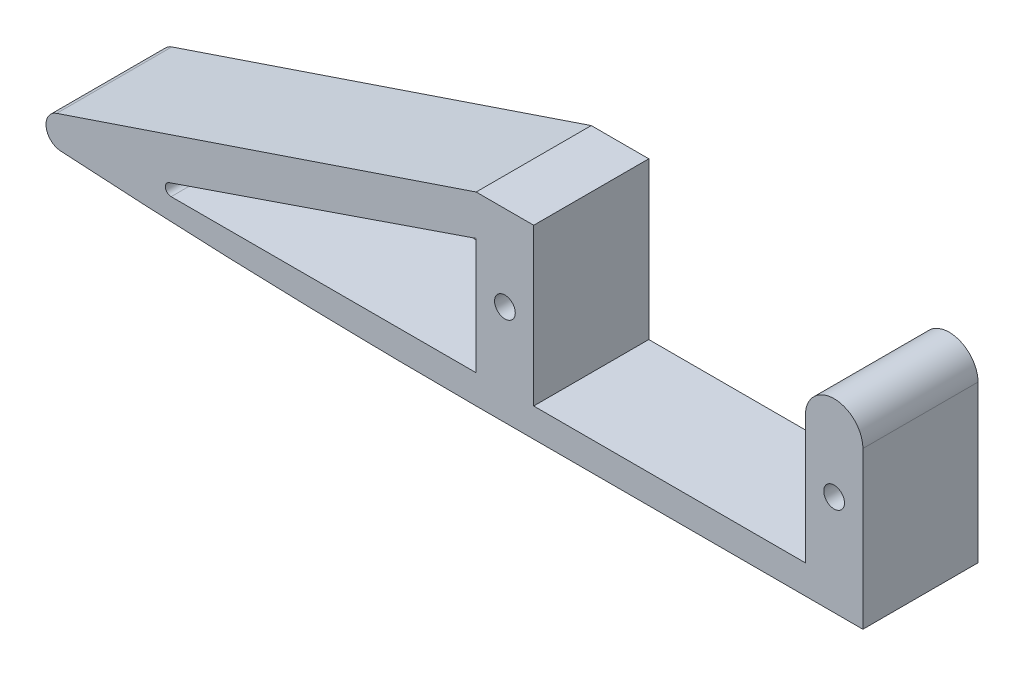
ISO-10303-21;
HEADER;
FILE_DESCRIPTION(('STEP AP214'),'2;1');
FILE_NAME('part.step','',(''),(''),'','','');
FILE_SCHEMA(('AUTOMOTIVE_DESIGN { 1 0 10303 214 1 1 1 1 }'));
ENDSEC;
DATA;
#1=APPLICATION_CONTEXT('core data for automotive mechanical design processes');
#2=APPLICATION_PROTOCOL_DEFINITION('international standard','automotive_design',2000,#1);
#3=PRODUCT_CONTEXT('',#1,'mechanical');
#4=PRODUCT('Part','Part','',(#3));
#5=PRODUCT_RELATED_PRODUCT_CATEGORY('part','',(#4));
#6=PRODUCT_DEFINITION_FORMATION('','',#4);
#7=PRODUCT_DEFINITION_CONTEXT('part definition',#1,'design');
#8=PRODUCT_DEFINITION('design','',#6,#7);
#9=PRODUCT_DEFINITION_SHAPE('','',#8);
#10=(LENGTH_UNIT() NAMED_UNIT(*) SI_UNIT(.MILLI.,.METRE.));
#11=(NAMED_UNIT(*) PLANE_ANGLE_UNIT() SI_UNIT($,.RADIAN.));
#12=(NAMED_UNIT(*) SI_UNIT($,.STERADIAN.) SOLID_ANGLE_UNIT());
#13=UNCERTAINTY_MEASURE_WITH_UNIT(LENGTH_MEASURE(1.E-05),#10,'distance_accuracy_value','');
#14=(GEOMETRIC_REPRESENTATION_CONTEXT(3) GLOBAL_UNCERTAINTY_ASSIGNED_CONTEXT((#13)) GLOBAL_UNIT_ASSIGNED_CONTEXT((#10,
#11,#12)) REPRESENTATION_CONTEXT('',''));
#15=CARTESIAN_POINT('',(0.,0.,0.));
#16=DIRECTION('',(0.,0.,1.));
#17=DIRECTION('',(1.,0.,0.));
#18=AXIS2_PLACEMENT_3D('',#15,#16,#17);
#19=CARTESIAN_POINT('',(-43.2987970035685,3.,5.));
#20=DIRECTION('',(0.,0.,1.));
#21=DIRECTION('',(1.,0.,0.));
#22=AXIS2_PLACEMENT_3D('',#19,#20,#21);
#23=CYLINDRICAL_SURFACE('',#22,0.5);
#24=CARTESIAN_POINT('',(-43.2987970035685,3.,5.));
#25=DIRECTION('',(0.,0.,-1.));
#26=DIRECTION('',(1.,0.,0.));
#27=AXIS2_PLACEMENT_3D('',#24,#25,#26);
#28=CIRCLE('',#27,0.5);
#29=CARTESIAN_POINT('',(-43.2987970035685,2.5,5.));
#30=VERTEX_POINT('',#29);
#31=CARTESIAN_POINT('',(-43.4608976764807,3.47299405053493,5.));
#32=VERTEX_POINT('',#31);
#33=EDGE_CURVE('E27',#30,#32,#28,.T.);
#34=ORIENTED_EDGE('',*,*,#33,.F.);
#35=DIRECTION('',(0.,0.,1.));
#36=VECTOR('',#35,1.);
#37=CARTESIAN_POINT('',(-43.2987970035685,2.5,5.));
#38=LINE('',#37,#36);
#39=CARTESIAN_POINT('',(-43.2987970035685,2.5,-5.));
#40=VERTEX_POINT('',#39);
#41=EDGE_CURVE('E150',#40,#30,#38,.T.);
#42=ORIENTED_EDGE('',*,*,#41,.F.);
#43=CARTESIAN_POINT('',(-43.2987970035685,3.,-5.));
#44=DIRECTION('',(0.,0.,1.));
#45=DIRECTION('',(1.,0.,0.));
#46=AXIS2_PLACEMENT_3D('',#43,#44,#45);
#47=CIRCLE('',#46,0.5);
#48=CARTESIAN_POINT('',(-43.4608976764807,3.47299405053493,-5.));
#49=VERTEX_POINT('',#48);
#50=EDGE_CURVE('E11',#49,#40,#47,.T.);
#51=ORIENTED_EDGE('',*,*,#50,.F.);
#52=DIRECTION('',(0.,0.,-1.));
#53=VECTOR('',#52,1.);
#54=CARTESIAN_POINT('',(-43.4608976764806,3.47299405053493,-5.));
#55=LINE('',#54,#53);
#56=EDGE_CURVE('E147',#32,#49,#55,.T.);
#57=ORIENTED_EDGE('',*,*,#56,.F.);
#58=EDGE_LOOP('',(#34,#42,#51,#57));
#59=FACE_BOUND('',#58,.T.);
#60=ADVANCED_FACE('F16',(#59),#23,.F.);
#61=CARTESIAN_POINT('',(-18.685,8.04999999999867,-5.));
#62=DIRECTION('',(0.,0.,1.));
#63=DIRECTION('',(1.,0.,0.));
#64=AXIS2_PLACEMENT_3D('',#61,#62,#63);
#65=PLANE('',#64);
#66=CARTESIAN_POINT('',(14.3,8.7,-5.));
#67=DIRECTION('',(0.,0.,1.));
#68=DIRECTION('',(1.,0.,0.));
#69=AXIS2_PLACEMENT_3D('',#66,#67,#68);
#70=CIRCLE('',#69,0.9);
#71=CARTESIAN_POINT('',(15.2,8.7,-5.));
#72=VERTEX_POINT('',#71);
#73=EDGE_CURVE('E39',#72,#72,#70,.T.);
#74=ORIENTED_EDGE('',*,*,#73,.T.);
#75=EDGE_LOOP('',(#74));
#76=FACE_BOUND('',#75,.T.);
#77=CARTESIAN_POINT('',(-14.3,8.7,-5.));
#78=DIRECTION('',(0.,0.,1.));
#79=DIRECTION('',(1.,0.,0.));
#80=AXIS2_PLACEMENT_3D('',#77,#78,#79);
#81=CIRCLE('',#80,0.9);
#82=CARTESIAN_POINT('',(-13.4,8.7,-5.));
#83=VERTEX_POINT('',#82);
#84=EDGE_CURVE('E81',#83,#83,#81,.T.);
#85=ORIENTED_EDGE('',*,*,#84,.T.);
#86=EDGE_LOOP('',(#85));
#87=FACE_BOUND('',#86,.T.);
#88=DIRECTION('',(0.,1.,0.));
#89=VECTOR('',#88,1.);
#90=CARTESIAN_POINT('',(-16.8,7.555,-5.));
#91=LINE('',#90,#89);
#92=CARTESIAN_POINT('',(-16.8,2.5,-5.));
#93=VERTEX_POINT('',#92);
#94=CARTESIAN_POINT('',(-16.8,12.61,-5.));
#95=VERTEX_POINT('',#94);
#96=EDGE_CURVE('E158',#93,#95,#91,.T.);
#97=ORIENTED_EDGE('',*,*,#96,.T.);
#98=DIRECTION('',(-0.945988101069844,-0.324201345824275,0.));
#99=VECTOR('',#98,1.);
#100=CARTESIAN_POINT('',(-31.55,7.555,-5.));
#101=LINE('',#100,#99);
#102=EDGE_CURVE('E154',#95,#49,#101,.T.);
#103=ORIENTED_EDGE('',*,*,#102,.T.);
#104=ORIENTED_EDGE('',*,*,#50,.T.);
#105=DIRECTION('',(1.,0.,0.));
#106=VECTOR('',#105,1.);
#107=CARTESIAN_POINT('',(-31.55,2.5,-5.));
#108=LINE('',#107,#106);
#109=EDGE_CURVE('E277',#40,#93,#108,.T.);
#110=ORIENTED_EDGE('',*,*,#109,.T.);
#111=EDGE_LOOP('',(#97,#103,#104,#110));
#112=FACE_BOUND('',#111,.T.);
#113=CARTESIAN_POINT('',(-52.8,2.5,-5.));
#114=DIRECTION('',(0.,0.,1.));
#115=DIRECTION('',(1.,0.,0.));
#116=AXIS2_PLACEMENT_3D('',#113,#114,#115);
#117=CIRCLE('',#116,1.37);
#118=CARTESIAN_POINT('',(-53.2382271517839,3.79802040178087,-5.));
#119=VERTEX_POINT('',#118);
#120=CARTESIAN_POINT('',(-52.7999999999604,1.13,-5.));
#121=VERTEX_POINT('',#120);
#122=EDGE_CURVE('E190',#119,#121,#117,.T.);
#123=ORIENTED_EDGE('',*,*,#122,.F.);
#124=DIRECTION('',(-0.94746014728531,-0.319873833418895,0.));
#125=VECTOR('',#124,1.);
#126=CARTESIAN_POINT('',(-35.0191135758919,9.94901020089044,-5.));
#127=LINE('',#126,#125);
#128=CARTESIAN_POINT('',(-16.8,16.1,-5.));
#129=VERTEX_POINT('',#128);
#130=EDGE_CURVE('E163',#129,#119,#127,.T.);
#131=ORIENTED_EDGE('',*,*,#130,.F.);
#132=DIRECTION('',(-1.,0.,0.));
#133=VECTOR('',#132,1.);
#134=CARTESIAN_POINT('',(-14.3,16.1,-5.));
#135=LINE('',#134,#133);
#136=CARTESIAN_POINT('',(-11.8,16.1,-5.));
#137=VERTEX_POINT('',#136);
#138=EDGE_CURVE('E256',#137,#129,#135,.T.);
#139=ORIENTED_EDGE('',*,*,#138,.F.);
#140=DIRECTION('',(0.,1.,0.));
#141=VECTOR('',#140,1.);
#142=CARTESIAN_POINT('',(-11.8,9.3,-5.));
#143=LINE('',#142,#141);
#144=CARTESIAN_POINT('',(-11.8,2.5,-5.));
#145=VERTEX_POINT('',#144);
#146=EDGE_CURVE('E225',#145,#137,#143,.T.);
#147=ORIENTED_EDGE('',*,*,#146,.F.);
#148=DIRECTION('',(-1.,0.,0.));
#149=VECTOR('',#148,1.);
#150=CARTESIAN_POINT('',(0.,2.5,-5.));
#151=LINE('',#150,#149);
#152=CARTESIAN_POINT('',(11.8,2.5,-5.));
#153=VERTEX_POINT('',#152);
#154=EDGE_CURVE('E209',#153,#145,#151,.T.);
#155=ORIENTED_EDGE('',*,*,#154,.F.);
#156=DIRECTION('',(0.,-1.,0.));
#157=VECTOR('',#156,1.);
#158=CARTESIAN_POINT('',(11.8,8.05,-5.));
#159=LINE('',#158,#157);
#160=CARTESIAN_POINT('',(11.8,13.6,-5.));
#161=VERTEX_POINT('',#160);
#162=EDGE_CURVE('E269',#161,#153,#159,.T.);
#163=ORIENTED_EDGE('',*,*,#162,.F.);
#164=CARTESIAN_POINT('',(14.3,13.6,-5.));
#165=DIRECTION('',(0.,0.,1.));
#166=DIRECTION('',(1.,0.,0.));
#167=AXIS2_PLACEMENT_3D('',#164,#165,#166);
#168=CIRCLE('',#167,2.5);
#169=CARTESIAN_POINT('',(16.8,13.6,-5.));
#170=VERTEX_POINT('',#169);
#171=EDGE_CURVE('E200',#170,#161,#168,.T.);
#172=ORIENTED_EDGE('',*,*,#171,.F.);
#173=DIRECTION('',(0.,1.,0.));
#174=VECTOR('',#173,1.);
#175=CARTESIAN_POINT('',(16.8,6.8,-5.));
#176=LINE('',#175,#174);
#177=CARTESIAN_POINT('',(16.8,0.,-5.));
#178=VERTEX_POINT('',#177);
#179=EDGE_CURVE('E217',#178,#170,#176,.T.);
#180=ORIENTED_EDGE('',*,*,#179,.F.);
#181=DIRECTION('',(-1.,0.,0.));
#182=VECTOR('',#181,1.);
#183=CARTESIAN_POINT('',(0.,0.,-5.));
#184=LINE('',#183,#182);
#185=CARTESIAN_POINT('',(-16.8,-2.66453525910038E-12,-5.));
#186=VERTEX_POINT('',#185);
#187=EDGE_CURVE('E243',#178,#186,#184,.T.);
#188=ORIENTED_EDGE('',*,*,#187,.T.);
#189=CARTESIAN_POINT('',(-16.8,574.016327433628,-5.));
#190=DIRECTION('',(0.,0.,1.));
#191=DIRECTION('',(1.,0.,0.));
#192=AXIS2_PLACEMENT_3D('',#189,#190,#191);
#193=CIRCLE('',#192,574.01632743363);
#194=EDGE_CURVE('E182',#121,#186,#193,.T.);
#195=ORIENTED_EDGE('',*,*,#194,.F.);
#196=EDGE_LOOP('',(#123,#131,#139,#147,#155,#163,#172,#180,#188,#195));
#197=FACE_BOUND('',#196,.T.);
#198=ADVANCED_FACE('F155',(#76,#87,#112,#197),#65,.F.);
#199=CARTESIAN_POINT('',(-18.685,8.04999999999867,5.));
#200=DIRECTION('',(0.,0.,1.));
#201=DIRECTION('',(1.,0.,0.));
#202=AXIS2_PLACEMENT_3D('',#199,#200,#201);
#203=PLANE('',#202);
#204=CARTESIAN_POINT('',(14.3,8.7,5.));
#205=DIRECTION('',(0.,0.,1.));
#206=DIRECTION('',(1.,0.,0.));
#207=AXIS2_PLACEMENT_3D('',#204,#205,#206);
#208=CIRCLE('',#207,0.9);
#209=CARTESIAN_POINT('',(15.2,8.7,5.));
#210=VERTEX_POINT('',#209);
#211=EDGE_CURVE('E221',#210,#210,#208,.T.);
#212=ORIENTED_EDGE('',*,*,#211,.F.);
#213=EDGE_LOOP('',(#212));
#214=FACE_BOUND('',#213,.T.);
#215=CARTESIAN_POINT('',(-14.3,8.7,5.));
#216=DIRECTION('',(0.,0.,1.));
#217=DIRECTION('',(1.,0.,0.));
#218=AXIS2_PLACEMENT_3D('',#215,#216,#217);
#219=CIRCLE('',#218,0.9);
#220=CARTESIAN_POINT('',(-13.4,8.7,5.));
#221=VERTEX_POINT('',#220);
#222=EDGE_CURVE('E93',#221,#221,#219,.T.);
#223=ORIENTED_EDGE('',*,*,#222,.F.);
#224=EDGE_LOOP('',(#223));
#225=FACE_BOUND('',#224,.T.);
#226=DIRECTION('',(0.,1.,0.));
#227=VECTOR('',#226,1.);
#228=CARTESIAN_POINT('',(-16.8,7.555,5.));
#229=LINE('',#228,#227);
#230=CARTESIAN_POINT('',(-16.8,2.5,5.));
#231=VERTEX_POINT('',#230);
#232=CARTESIAN_POINT('',(-16.8,12.61,5.));
#233=VERTEX_POINT('',#232);
#234=EDGE_CURVE('E184',#231,#233,#229,.T.);
#235=ORIENTED_EDGE('',*,*,#234,.F.);
#236=DIRECTION('',(1.,0.,0.));
#237=VECTOR('',#236,1.);
#238=CARTESIAN_POINT('',(-31.55,2.5,5.));
#239=LINE('',#238,#237);
#240=EDGE_CURVE('E195',#30,#231,#239,.T.);
#241=ORIENTED_EDGE('',*,*,#240,.F.);
#242=ORIENTED_EDGE('',*,*,#33,.T.);
#243=DIRECTION('',(-0.945988101069844,-0.324201345824275,0.));
#244=VECTOR('',#243,1.);
#245=CARTESIAN_POINT('',(-31.55,7.555,5.));
#246=LINE('',#245,#244);
#247=EDGE_CURVE('E166',#233,#32,#246,.T.);
#248=ORIENTED_EDGE('',*,*,#247,.F.);
#249=EDGE_LOOP('',(#235,#241,#242,#248));
#250=FACE_BOUND('',#249,.T.);
#251=CARTESIAN_POINT('',(-52.8,2.5,5.));
#252=DIRECTION('',(0.,0.,1.));
#253=DIRECTION('',(1.,0.,0.));
#254=AXIS2_PLACEMENT_3D('',#251,#252,#253);
#255=CIRCLE('',#254,1.37);
#256=CARTESIAN_POINT('',(-53.2382271517839,3.79802040178087,5.));
#257=VERTEX_POINT('',#256);
#258=CARTESIAN_POINT('',(-52.7999999999604,1.13,5.));
#259=VERTEX_POINT('',#258);
#260=EDGE_CURVE('E183',#257,#259,#255,.T.);
#261=ORIENTED_EDGE('',*,*,#260,.T.);
#262=CARTESIAN_POINT('',(-16.8,574.016327433628,5.));
#263=DIRECTION('',(0.,0.,1.));
#264=DIRECTION('',(1.,0.,0.));
#265=AXIS2_PLACEMENT_3D('',#262,#263,#264);
#266=CIRCLE('',#265,574.01632743363);
#267=CARTESIAN_POINT('',(-16.8,-2.66453525910038E-12,5.));
#268=VERTEX_POINT('',#267);
#269=EDGE_CURVE('E232',#259,#268,#266,.T.);
#270=ORIENTED_EDGE('',*,*,#269,.T.);
#271=DIRECTION('',(-1.,0.,0.));
#272=VECTOR('',#271,1.);
#273=CARTESIAN_POINT('',(0.,0.,5.));
#274=LINE('',#273,#272);
#275=CARTESIAN_POINT('',(16.8,0.,5.));
#276=VERTEX_POINT('',#275);
#277=EDGE_CURVE('E262',#276,#268,#274,.T.);
#278=ORIENTED_EDGE('',*,*,#277,.F.);
#279=DIRECTION('',(0.,1.,0.));
#280=VECTOR('',#279,1.);
#281=CARTESIAN_POINT('',(16.8,6.8,5.));
#282=LINE('',#281,#280);
#283=CARTESIAN_POINT('',(16.8,13.6,5.));
#284=VERTEX_POINT('',#283);
#285=EDGE_CURVE('E196',#276,#284,#282,.T.);
#286=ORIENTED_EDGE('',*,*,#285,.T.);
#287=CARTESIAN_POINT('',(14.3,13.6,5.));
#288=DIRECTION('',(0.,0.,1.));
#289=DIRECTION('',(1.,0.,0.));
#290=AXIS2_PLACEMENT_3D('',#287,#288,#289);
#291=CIRCLE('',#290,2.5);
#292=CARTESIAN_POINT('',(11.8,13.6,5.));
#293=VERTEX_POINT('',#292);
#294=EDGE_CURVE('E176',#284,#293,#291,.T.);
#295=ORIENTED_EDGE('',*,*,#294,.T.);
#296=DIRECTION('',(0.,-1.,0.));
#297=VECTOR('',#296,1.);
#298=CARTESIAN_POINT('',(11.8,8.05,5.));
#299=LINE('',#298,#297);
#300=CARTESIAN_POINT('',(11.8,2.5,5.));
#301=VERTEX_POINT('',#300);
#302=EDGE_CURVE('E357',#293,#301,#299,.T.);
#303=ORIENTED_EDGE('',*,*,#302,.T.);
#304=DIRECTION('',(-1.,0.,0.));
#305=VECTOR('',#304,1.);
#306=CARTESIAN_POINT('',(0.,2.5,5.));
#307=LINE('',#306,#305);
#308=CARTESIAN_POINT('',(-11.8,2.5,5.));
#309=VERTEX_POINT('',#308);
#310=EDGE_CURVE('E208',#301,#309,#307,.T.);
#311=ORIENTED_EDGE('',*,*,#310,.T.);
#312=DIRECTION('',(0.,1.,0.));
#313=VECTOR('',#312,1.);
#314=CARTESIAN_POINT('',(-11.8,9.3,5.));
#315=LINE('',#314,#313);
#316=CARTESIAN_POINT('',(-11.8,16.1,5.));
#317=VERTEX_POINT('',#316);
#318=EDGE_CURVE('E261',#309,#317,#315,.T.);
#319=ORIENTED_EDGE('',*,*,#318,.T.);
#320=DIRECTION('',(-1.,0.,0.));
#321=VECTOR('',#320,1.);
#322=CARTESIAN_POINT('',(-14.3,16.1,5.));
#323=LINE('',#322,#321);
#324=CARTESIAN_POINT('',(-16.8,16.1,5.));
#325=VERTEX_POINT('',#324);
#326=EDGE_CURVE('E220',#317,#325,#323,.T.);
#327=ORIENTED_EDGE('',*,*,#326,.T.);
#328=DIRECTION('',(-0.94746014728531,-0.319873833418895,0.));
#329=VECTOR('',#328,1.);
#330=CARTESIAN_POINT('',(-35.0191135758919,9.94901020089044,5.));
#331=LINE('',#330,#329);
#332=EDGE_CURVE('E223',#325,#257,#331,.T.);
#333=ORIENTED_EDGE('',*,*,#332,.T.);
#334=EDGE_LOOP('',(#261,#270,#278,#286,#295,#303,#311,#319,#327,#333));
#335=FACE_BOUND('',#334,.T.);
#336=ADVANCED_FACE('F288',(#214,#225,#250,#335),#203,.T.);
#337=CARTESIAN_POINT('',(14.3,8.7,5.));
#338=DIRECTION('',(0.,0.,-1.));
#339=DIRECTION('',(-1.,0.,0.));
#340=AXIS2_PLACEMENT_3D('',#337,#338,#339);
#341=CYLINDRICAL_SURFACE('',#340,0.9);
#342=ORIENTED_EDGE('',*,*,#73,.F.);
#343=EDGE_LOOP('',(#342));
#344=FACE_BOUND('',#343,.T.);
#345=ORIENTED_EDGE('',*,*,#211,.T.);
#346=EDGE_LOOP('',(#345));
#347=FACE_BOUND('',#346,.T.);
#348=ADVANCED_FACE('F18',(#344,#347),#341,.F.);
#349=CARTESIAN_POINT('',(-35.0191135758919,9.94901020089044,5.));
#350=DIRECTION('',(0.319873833418895,-0.94746014728531,0.));
#351=DIRECTION('',(0.,0.,-1.));
#352=AXIS2_PLACEMENT_3D('',#349,#350,#351);
#353=PLANE('',#352);
#354=ORIENTED_EDGE('',*,*,#130,.T.);
#355=DIRECTION('',(0.,0.,-1.));
#356=VECTOR('',#355,1.);
#357=CARTESIAN_POINT('',(-53.2382271517839,3.79802040178087,5.));
#358=LINE('',#357,#356);
#359=EDGE_CURVE('E178',#257,#119,#358,.T.);
#360=ORIENTED_EDGE('',*,*,#359,.F.);
#361=ORIENTED_EDGE('',*,*,#332,.F.);
#362=DIRECTION('',(0.,0.,-1.));
#363=VECTOR('',#362,1.);
#364=CARTESIAN_POINT('',(-16.8,16.1,5.));
#365=LINE('',#364,#363);
#366=EDGE_CURVE('E260',#325,#129,#365,.T.);
#367=ORIENTED_EDGE('',*,*,#366,.T.);
#368=EDGE_LOOP('',(#354,#360,#361,#367));
#369=FACE_BOUND('',#368,.T.);
#370=ADVANCED_FACE('F404',(#369),#353,.F.);
#371=CARTESIAN_POINT('',(-31.55,7.555,5.));
#372=DIRECTION('',(0.324201345824275,-0.945988101069844,0.));
#373=DIRECTION('',(0.,0.,-1.));
#374=AXIS2_PLACEMENT_3D('',#371,#372,#373);
#375=PLANE('',#374);
#376=ORIENTED_EDGE('',*,*,#247,.T.);
#377=ORIENTED_EDGE('',*,*,#56,.T.);
#378=ORIENTED_EDGE('',*,*,#102,.F.);
#379=DIRECTION('',(0.,0.,-1.));
#380=VECTOR('',#379,1.);
#381=CARTESIAN_POINT('',(-16.8,12.61,5.));
#382=LINE('',#381,#380);
#383=EDGE_CURVE('E188',#233,#95,#382,.T.);
#384=ORIENTED_EDGE('',*,*,#383,.F.);
#385=EDGE_LOOP('',(#376,#377,#378,#384));
#386=FACE_BOUND('',#385,.T.);
#387=ADVANCED_FACE('F165',(#386),#375,.T.);
#388=CARTESIAN_POINT('',(-14.3,8.7,5.));
#389=DIRECTION('',(0.,0.,-1.));
#390=DIRECTION('',(-1.,0.,0.));
#391=AXIS2_PLACEMENT_3D('',#388,#389,#390);
#392=CYLINDRICAL_SURFACE('',#391,0.9);
#393=ORIENTED_EDGE('',*,*,#84,.F.);
#394=EDGE_LOOP('',(#393));
#395=FACE_BOUND('',#394,.T.);
#396=ORIENTED_EDGE('',*,*,#222,.T.);
#397=EDGE_LOOP('',(#396));
#398=FACE_BOUND('',#397,.T.);
#399=ADVANCED_FACE('F403',(#395,#398),#392,.F.);
#400=CARTESIAN_POINT('',(-14.3,16.1,5.));
#401=DIRECTION('',(0.,-1.,0.));
#402=DIRECTION('',(0.,0.,-1.));
#403=AXIS2_PLACEMENT_3D('',#400,#401,#402);
#404=PLANE('',#403);
#405=ORIENTED_EDGE('',*,*,#138,.T.);
#406=ORIENTED_EDGE('',*,*,#366,.F.);
#407=ORIENTED_EDGE('',*,*,#326,.F.);
#408=DIRECTION('',(0.,0.,-1.));
#409=VECTOR('',#408,1.);
#410=CARTESIAN_POINT('',(-11.8,16.1,5.));
#411=LINE('',#410,#409);
#412=EDGE_CURVE('E228',#317,#137,#411,.T.);
#413=ORIENTED_EDGE('',*,*,#412,.T.);
#414=EDGE_LOOP('',(#405,#406,#407,#413));
#415=FACE_BOUND('',#414,.T.);
#416=ADVANCED_FACE('F321',(#415),#404,.F.);
#417=CARTESIAN_POINT('',(-11.8,9.3,5.));
#418=DIRECTION('',(-1.,0.,0.));
#419=DIRECTION('',(0.,0.,1.));
#420=AXIS2_PLACEMENT_3D('',#417,#418,#419);
#421=PLANE('',#420);
#422=ORIENTED_EDGE('',*,*,#146,.T.);
#423=ORIENTED_EDGE('',*,*,#412,.F.);
#424=ORIENTED_EDGE('',*,*,#318,.F.);
#425=DIRECTION('',(0.,0.,-1.));
#426=VECTOR('',#425,1.);
#427=CARTESIAN_POINT('',(-11.8,2.5,5.));
#428=LINE('',#427,#426);
#429=EDGE_CURVE('E204',#309,#145,#428,.T.);
#430=ORIENTED_EDGE('',*,*,#429,.T.);
#431=EDGE_LOOP('',(#422,#423,#424,#430));
#432=FACE_BOUND('',#431,.T.);
#433=ADVANCED_FACE('F570',(#432),#421,.F.);
#434=CARTESIAN_POINT('',(0.,2.5,5.));
#435=DIRECTION('',(0.,-1.,0.));
#436=DIRECTION('',(0.,0.,-1.));
#437=AXIS2_PLACEMENT_3D('',#434,#435,#436);
#438=PLANE('',#437);
#439=ORIENTED_EDGE('',*,*,#154,.T.);
#440=ORIENTED_EDGE('',*,*,#429,.F.);
#441=ORIENTED_EDGE('',*,*,#310,.F.);
#442=DIRECTION('',(0.,0.,-1.));
#443=VECTOR('',#442,1.);
#444=CARTESIAN_POINT('',(11.8,2.5,5.));
#445=LINE('',#444,#443);
#446=EDGE_CURVE('E20',#301,#153,#445,.T.);
#447=ORIENTED_EDGE('',*,*,#446,.T.);
#448=EDGE_LOOP('',(#439,#440,#441,#447));
#449=FACE_BOUND('',#448,.T.);
#450=ADVANCED_FACE('F401',(#449),#438,.F.);
#451=CARTESIAN_POINT('',(11.8,8.05,5.));
#452=DIRECTION('',(1.,0.,0.));
#453=DIRECTION('',(0.,1.,0.));
#454=AXIS2_PLACEMENT_3D('',#451,#452,#453);
#455=PLANE('',#454);
#456=ORIENTED_EDGE('',*,*,#162,.T.);
#457=ORIENTED_EDGE('',*,*,#446,.F.);
#458=ORIENTED_EDGE('',*,*,#302,.F.);
#459=DIRECTION('',(0.,0.,-1.));
#460=VECTOR('',#459,1.);
#461=CARTESIAN_POINT('',(11.8,13.6,5.));
#462=LINE('',#461,#460);
#463=EDGE_CURVE('E213',#293,#161,#462,.T.);
#464=ORIENTED_EDGE('',*,*,#463,.T.);
#465=EDGE_LOOP('',(#456,#457,#458,#464));
#466=FACE_BOUND('',#465,.T.);
#467=ADVANCED_FACE('F397',(#466),#455,.F.);
#468=CARTESIAN_POINT('',(14.3,13.6,5.));
#469=DIRECTION('',(0.,0.,-1.));
#470=DIRECTION('',(-1.,0.,0.));
#471=AXIS2_PLACEMENT_3D('',#468,#469,#470);
#472=CYLINDRICAL_SURFACE('',#471,2.5);
#473=ORIENTED_EDGE('',*,*,#171,.T.);
#474=ORIENTED_EDGE('',*,*,#463,.F.);
#475=ORIENTED_EDGE('',*,*,#294,.F.);
#476=DIRECTION('',(0.,0.,-1.));
#477=VECTOR('',#476,1.);
#478=CARTESIAN_POINT('',(16.8,13.6,5.));
#479=LINE('',#478,#477);
#480=EDGE_CURVE('E201',#284,#170,#479,.T.);
#481=ORIENTED_EDGE('',*,*,#480,.T.);
#482=EDGE_LOOP('',(#473,#474,#475,#481));
#483=FACE_BOUND('',#482,.T.);
#484=ADVANCED_FACE('F400',(#483),#472,.T.);
#485=CARTESIAN_POINT('',(16.8,6.8,5.));
#486=DIRECTION('',(-1.,0.,0.));
#487=DIRECTION('',(0.,0.,1.));
#488=AXIS2_PLACEMENT_3D('',#485,#486,#487);
#489=PLANE('',#488);
#490=ORIENTED_EDGE('',*,*,#179,.T.);
#491=ORIENTED_EDGE('',*,*,#480,.F.);
#492=ORIENTED_EDGE('',*,*,#285,.F.);
#493=DIRECTION('',(0.,0.,-1.));
#494=VECTOR('',#493,1.);
#495=CARTESIAN_POINT('',(16.8,0.,5.));
#496=LINE('',#495,#494);
#497=EDGE_CURVE('E265',#276,#178,#496,.T.);
#498=ORIENTED_EDGE('',*,*,#497,.T.);
#499=EDGE_LOOP('',(#490,#491,#492,#498));
#500=FACE_BOUND('',#499,.T.);
#501=ADVANCED_FACE('F377',(#500),#489,.F.);
#502=CARTESIAN_POINT('',(0.,0.,5.));
#503=DIRECTION('',(0.,-1.,0.));
#504=DIRECTION('',(0.,0.,-1.));
#505=AXIS2_PLACEMENT_3D('',#502,#503,#504);
#506=PLANE('',#505);
#507=ORIENTED_EDGE('',*,*,#187,.F.);
#508=ORIENTED_EDGE('',*,*,#497,.F.);
#509=ORIENTED_EDGE('',*,*,#277,.T.);
#510=DIRECTION('',(0.,0.,-1.));
#511=VECTOR('',#510,1.);
#512=CARTESIAN_POINT('',(-16.8,-2.66453525910038E-12,5.));
#513=LINE('',#512,#511);
#514=EDGE_CURVE('E229',#268,#186,#513,.T.);
#515=ORIENTED_EDGE('',*,*,#514,.T.);
#516=EDGE_LOOP('',(#507,#508,#509,#515));
#517=FACE_BOUND('',#516,.T.);
#518=ADVANCED_FACE('F362',(#517),#506,.T.);
#519=CARTESIAN_POINT('',(-16.8,574.016327433628,5.));
#520=DIRECTION('',(0.,0.,-1.));
#521=DIRECTION('',(-1.,0.,0.));
#522=AXIS2_PLACEMENT_3D('',#519,#520,#521);
#523=CYLINDRICAL_SURFACE('',#522,574.01632743363);
#524=ORIENTED_EDGE('',*,*,#194,.T.);
#525=ORIENTED_EDGE('',*,*,#514,.F.);
#526=ORIENTED_EDGE('',*,*,#269,.F.);
#527=DIRECTION('',(0.,0.,-1.));
#528=VECTOR('',#527,1.);
#529=CARTESIAN_POINT('',(-52.7999999999604,1.13,5.));
#530=LINE('',#529,#528);
#531=EDGE_CURVE('E194',#259,#121,#530,.T.);
#532=ORIENTED_EDGE('',*,*,#531,.T.);
#533=EDGE_LOOP('',(#524,#525,#526,#532));
#534=FACE_BOUND('',#533,.T.);
#535=ADVANCED_FACE('F366',(#534),#523,.T.);
#536=CARTESIAN_POINT('',(-52.8,2.5,5.));
#537=DIRECTION('',(0.,0.,-1.));
#538=DIRECTION('',(-1.,0.,0.));
#539=AXIS2_PLACEMENT_3D('',#536,#537,#538);
#540=CYLINDRICAL_SURFACE('',#539,1.37);
#541=ORIENTED_EDGE('',*,*,#122,.T.);
#542=ORIENTED_EDGE('',*,*,#531,.F.);
#543=ORIENTED_EDGE('',*,*,#260,.F.);
#544=ORIENTED_EDGE('',*,*,#359,.T.);
#545=EDGE_LOOP('',(#541,#542,#543,#544));
#546=FACE_BOUND('',#545,.T.);
#547=ADVANCED_FACE('F368',(#546),#540,.T.);
#548=CARTESIAN_POINT('',(-31.55,2.5,5.));
#549=DIRECTION('',(0.,1.,0.));
#550=DIRECTION('',(1.,0.,0.));
#551=AXIS2_PLACEMENT_3D('',#548,#549,#550);
#552=PLANE('',#551);
#553=ORIENTED_EDGE('',*,*,#109,.F.);
#554=ORIENTED_EDGE('',*,*,#41,.T.);
#555=ORIENTED_EDGE('',*,*,#240,.T.);
#556=DIRECTION('',(0.,0.,-1.));
#557=VECTOR('',#556,1.);
#558=CARTESIAN_POINT('',(-16.8,2.5,5.));
#559=LINE('',#558,#557);
#560=EDGE_CURVE('E189',#231,#93,#559,.T.);
#561=ORIENTED_EDGE('',*,*,#560,.T.);
#562=EDGE_LOOP('',(#553,#554,#555,#561));
#563=FACE_BOUND('',#562,.T.);
#564=ADVANCED_FACE('F285',(#563),#552,.T.);
#565=CARTESIAN_POINT('',(-16.8,7.555,5.));
#566=DIRECTION('',(-1.,0.,0.));
#567=DIRECTION('',(0.,0.,1.));
#568=AXIS2_PLACEMENT_3D('',#565,#566,#567);
#569=PLANE('',#568);
#570=ORIENTED_EDGE('',*,*,#96,.F.);
#571=ORIENTED_EDGE('',*,*,#560,.F.);
#572=ORIENTED_EDGE('',*,*,#234,.T.);
#573=ORIENTED_EDGE('',*,*,#383,.T.);
#574=EDGE_LOOP('',(#570,#571,#572,#573));
#575=FACE_BOUND('',#574,.T.);
#576=ADVANCED_FACE('F291',(#575),#569,.T.);
#577=CLOSED_SHELL('',(#60,#198,#336,#348,#370,#387,#399,#416,#433,#450,#467,#484,#501,#518,#535,
#547,#564,#576));
#578=MANIFOLD_SOLID_BREP('B1',#577);
#579=ADVANCED_BREP_SHAPE_REPRESENTATION('',(#18,#578),#14);
#580=SHAPE_DEFINITION_REPRESENTATION(#9,#579);
ENDSEC;
END-ISO-10303-21;
